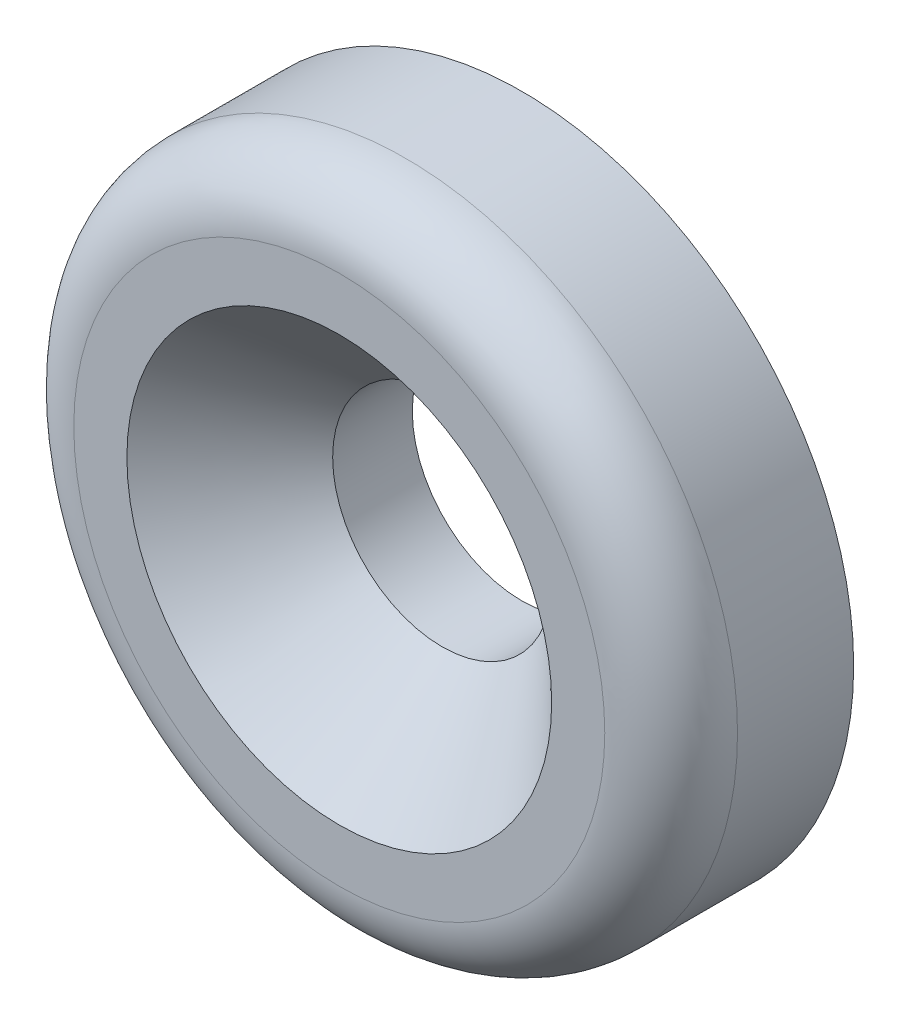
ISO-10303-21;
HEADER;
FILE_DESCRIPTION(('STEP AP214'),'2;1');
FILE_NAME('part.step','',(''),(''),'','','');
FILE_SCHEMA(('AUTOMOTIVE_DESIGN { 1 0 10303 214 1 1 1 1 }'));
ENDSEC;
DATA;
#1=APPLICATION_CONTEXT('core data for automotive mechanical design processes');
#2=APPLICATION_PROTOCOL_DEFINITION('international standard','automotive_design',2000,#1);
#3=PRODUCT_CONTEXT('',#1,'mechanical');
#4=PRODUCT('Part','Part','',(#3));
#5=PRODUCT_RELATED_PRODUCT_CATEGORY('part','',(#4));
#6=PRODUCT_DEFINITION_FORMATION('','',#4);
#7=PRODUCT_DEFINITION_CONTEXT('part definition',#1,'design');
#8=PRODUCT_DEFINITION('design','',#6,#7);
#9=PRODUCT_DEFINITION_SHAPE('','',#8);
#10=(LENGTH_UNIT() NAMED_UNIT(*) SI_UNIT(.MILLI.,.METRE.));
#11=(NAMED_UNIT(*) PLANE_ANGLE_UNIT() SI_UNIT($,.RADIAN.));
#12=(NAMED_UNIT(*) SI_UNIT($,.STERADIAN.) SOLID_ANGLE_UNIT());
#13=UNCERTAINTY_MEASURE_WITH_UNIT(LENGTH_MEASURE(1.E-05),#10,'distance_accuracy_value','');
#14=(GEOMETRIC_REPRESENTATION_CONTEXT(3) GLOBAL_UNCERTAINTY_ASSIGNED_CONTEXT((#13)) GLOBAL_UNIT_ASSIGNED_CONTEXT((#10,
#11,#12)) REPRESENTATION_CONTEXT('',''));
#15=CARTESIAN_POINT('',(0.,0.,0.));
#16=DIRECTION('',(0.,0.,1.));
#17=DIRECTION('',(1.,0.,0.));
#18=AXIS2_PLACEMENT_3D('',#15,#16,#17);
#19=CARTESIAN_POINT('',(0.,0.,2.75));
#20=DIRECTION('',(0.,0.,1.));
#21=DIRECTION('',(1.,0.,0.));
#22=AXIS2_PLACEMENT_3D('',#19,#20,#21);
#23=PLANE('',#22);
#24=CARTESIAN_POINT('',(0.,0.,2.75));
#25=DIRECTION('',(0.,0.,1.));
#26=DIRECTION('',(1.,0.,0.));
#27=AXIS2_PLACEMENT_3D('',#24,#25,#26);
#28=CIRCLE('',#27,4.);
#29=CARTESIAN_POINT('',(4.,0.,2.75));
#30=VERTEX_POINT('',#29);
#31=EDGE_CURVE('E48',#30,#30,#28,.T.);
#32=ORIENTED_EDGE('',*,*,#31,.T.);
#33=EDGE_LOOP('',(#32));
#34=FACE_BOUND('',#33,.T.);
#35=CARTESIAN_POINT('',(0.,0.,2.75));
#36=DIRECTION('',(0.,0.,1.));
#37=DIRECTION('',(1.,0.,0.));
#38=AXIS2_PLACEMENT_3D('',#35,#36,#37);
#39=CIRCLE('',#38,3.20000000000001);
#40=CARTESIAN_POINT('',(3.20000000000001,0.,2.75));
#41=VERTEX_POINT('',#40);
#42=EDGE_CURVE('E52',#41,#41,#39,.F.);
#43=ORIENTED_EDGE('',*,*,#42,.T.);
#44=EDGE_LOOP('',(#43));
#45=FACE_BOUND('',#44,.T.);
#46=ADVANCED_FACE('F41',(#34,#45),#23,.T.);
#47=CARTESIAN_POINT('',(0.,0.,0.));
#48=DIRECTION('',(0.,0.,1.));
#49=DIRECTION('',(1.,0.,0.));
#50=AXIS2_PLACEMENT_3D('',#47,#48,#49);
#51=PLANE('',#50);
#52=CARTESIAN_POINT('',(0.,0.,0.));
#53=DIRECTION('',(0.,0.,1.));
#54=DIRECTION('',(1.,0.,0.));
#55=AXIS2_PLACEMENT_3D('',#52,#53,#54);
#56=CIRCLE('',#55,5.);
#57=CARTESIAN_POINT('',(5.,0.,0.));
#58=VERTEX_POINT('',#57);
#59=EDGE_CURVE('E61',#58,#58,#56,.T.);
#60=ORIENTED_EDGE('',*,*,#59,.F.);
#61=EDGE_LOOP('',(#60));
#62=FACE_BOUND('',#61,.T.);
#63=CARTESIAN_POINT('',(0.,0.,0.));
#64=DIRECTION('',(0.,0.,1.));
#65=DIRECTION('',(1.,0.,0.));
#66=AXIS2_PLACEMENT_3D('',#63,#64,#65);
#67=CIRCLE('',#66,1.65);
#68=CARTESIAN_POINT('',(1.65,0.,0.));
#69=VERTEX_POINT('',#68);
#70=EDGE_CURVE('E64',#69,#69,#67,.T.);
#71=ORIENTED_EDGE('',*,*,#70,.T.);
#72=EDGE_LOOP('',(#71));
#73=FACE_BOUND('',#72,.T.);
#74=ADVANCED_FACE('F68',(#62,#73),#51,.F.);
#75=CARTESIAN_POINT('',(0.,0.,2.75));
#76=DIRECTION('',(0.,0.,-1.));
#77=DIRECTION('',(-1.,0.,0.));
#78=AXIS2_PLACEMENT_3D('',#75,#76,#77);
#79=CYLINDRICAL_SURFACE('',#78,5.);
#80=CARTESIAN_POINT('',(0.,0.,1.75));
#81=DIRECTION('',(0.,0.,1.));
#82=DIRECTION('',(1.,0.,0.));
#83=AXIS2_PLACEMENT_3D('',#80,#81,#82);
#84=CIRCLE('',#83,5.);
#85=CARTESIAN_POINT('',(5.,0.,1.75));
#86=VERTEX_POINT('',#85);
#87=EDGE_CURVE('E10',#86,#86,#84,.F.);
#88=ORIENTED_EDGE('',*,*,#87,.T.);
#89=EDGE_LOOP('',(#88));
#90=FACE_BOUND('',#89,.T.);
#91=ORIENTED_EDGE('',*,*,#59,.T.);
#92=EDGE_LOOP('',(#91));
#93=FACE_BOUND('',#92,.T.);
#94=ADVANCED_FACE('F73',(#90,#93),#79,.T.);
#95=CARTESIAN_POINT('',(0.,0.,2.75));
#96=DIRECTION('',(0.,0.,-1.));
#97=DIRECTION('',(-1.,0.,0.));
#98=AXIS2_PLACEMENT_3D('',#95,#96,#97);
#99=CYLINDRICAL_SURFACE('',#98,1.65);
#100=CARTESIAN_POINT('',(0.,0.,1.2));
#101=DIRECTION('',(0.,0.,1.));
#102=DIRECTION('',(1.,0.,0.));
#103=AXIS2_PLACEMENT_3D('',#100,#101,#102);
#104=CIRCLE('',#103,1.65);
#105=CARTESIAN_POINT('',(1.65,0.,1.2));
#106=VERTEX_POINT('',#105);
#107=EDGE_CURVE('E56',#106,#106,#104,.T.);
#108=ORIENTED_EDGE('',*,*,#107,.T.);
#109=EDGE_LOOP('',(#108));
#110=FACE_BOUND('',#109,.T.);
#111=ORIENTED_EDGE('',*,*,#70,.F.);
#112=EDGE_LOOP('',(#111));
#113=FACE_BOUND('',#112,.T.);
#114=ADVANCED_FACE('F70',(#110,#113),#99,.F.);
#115=CARTESIAN_POINT('',(0.,0.,1.2));
#116=DIRECTION('',(0.,0.,1.));
#117=DIRECTION('',(1.,0.,0.));
#118=AXIS2_PLACEMENT_3D('',#115,#116,#117);
#119=CONICAL_SURFACE('',#118,1.65,0.785398163397451);
#120=ORIENTED_EDGE('',*,*,#42,.F.);
#121=EDGE_LOOP('',(#120));
#122=FACE_BOUND('',#121,.T.);
#123=ORIENTED_EDGE('',*,*,#107,.F.);
#124=EDGE_LOOP('',(#123));
#125=FACE_BOUND('',#124,.T.);
#126=ADVANCED_FACE('F72',(#122,#125),#119,.F.);
#127=CARTESIAN_POINT('',(0.,0.,1.75));
#128=DIRECTION('',(0.,0.,1.));
#129=DIRECTION('',(1.,0.,0.));
#130=AXIS2_PLACEMENT_3D('',#127,#128,#129);
#131=TOROIDAL_SURFACE('',#130,4.,1.);
#132=ORIENTED_EDGE('',*,*,#87,.F.);
#133=EDGE_LOOP('',(#132));
#134=FACE_BOUND('',#133,.T.);
#135=ORIENTED_EDGE('',*,*,#31,.F.);
#136=EDGE_LOOP('',(#135));
#137=FACE_BOUND('',#136,.T.);
#138=ADVANCED_FACE('F43',(#134,#137),#131,.T.);
#139=CLOSED_SHELL('',(#46,#74,#94,#114,#126,#138));
#140=MANIFOLD_SOLID_BREP('B2',#139);
#141=ADVANCED_BREP_SHAPE_REPRESENTATION('',(#18,#140),#14);
#142=SHAPE_DEFINITION_REPRESENTATION(#9,#141);
ENDSEC;
END-ISO-10303-21;
